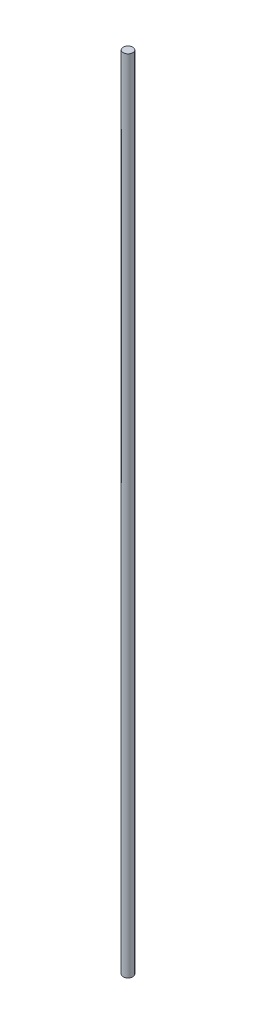
ISO-10303-21;
HEADER;
FILE_DESCRIPTION(('STEP AP214'),'2;1');
FILE_NAME('part.step','',(''),(''),'','','');
FILE_SCHEMA(('AUTOMOTIVE_DESIGN { 1 0 10303 214 1 1 1 1 }'));
ENDSEC;
DATA;
#1=APPLICATION_CONTEXT('core data for automotive mechanical design processes');
#2=APPLICATION_PROTOCOL_DEFINITION('international standard','automotive_design',2000,#1);
#3=PRODUCT_CONTEXT('',#1,'mechanical');
#4=PRODUCT('Part','Part','',(#3));
#5=PRODUCT_RELATED_PRODUCT_CATEGORY('part','',(#4));
#6=PRODUCT_DEFINITION_FORMATION('','',#4);
#7=PRODUCT_DEFINITION_CONTEXT('part definition',#1,'design');
#8=PRODUCT_DEFINITION('design','',#6,#7);
#9=PRODUCT_DEFINITION_SHAPE('','',#8);
#10=(LENGTH_UNIT() NAMED_UNIT(*) SI_UNIT(.MILLI.,.METRE.));
#11=(NAMED_UNIT(*) PLANE_ANGLE_UNIT() SI_UNIT($,.RADIAN.));
#12=(NAMED_UNIT(*) SI_UNIT($,.STERADIAN.) SOLID_ANGLE_UNIT());
#13=UNCERTAINTY_MEASURE_WITH_UNIT(LENGTH_MEASURE(1.E-05),#10,'distance_accuracy_value','');
#14=(GEOMETRIC_REPRESENTATION_CONTEXT(3) GLOBAL_UNCERTAINTY_ASSIGNED_CONTEXT((#13)) GLOBAL_UNIT_ASSIGNED_CONTEXT((#10,
#11,#12)) REPRESENTATION_CONTEXT('',''));
#15=CARTESIAN_POINT('',(0.,0.,0.));
#16=DIRECTION('',(0.,0.,1.));
#17=DIRECTION('',(1.,0.,0.));
#18=AXIS2_PLACEMENT_3D('',#15,#16,#17);
#19=CARTESIAN_POINT('',(0.,2080.,-2.9868094022561));
#20=DIRECTION('',(0.,-1.,0.));
#21=DIRECTION('',(0.,0.,-1.));
#22=AXIS2_PLACEMENT_3D('',#19,#20,#21);
#23=CYLINDRICAL_SURFACE('',#22,12.5);
#24=CARTESIAN_POINT('',(0.,2080.,-2.9868094022561));
#25=DIRECTION('',(0.,1.,0.));
#26=DIRECTION('',(0.,0.,1.));
#27=AXIS2_PLACEMENT_3D('',#24,#25,#26);
#28=CIRCLE('',#27,12.5);
#29=CARTESIAN_POINT('',(0.,2080.,9.51319059774391));
#30=VERTEX_POINT('',#29);
#31=EDGE_CURVE('E10',#30,#30,#28,.T.);
#32=ORIENTED_EDGE('',*,*,#31,.F.);
#33=EDGE_LOOP('',(#32));
#34=FACE_BOUND('',#33,.T.);
#35=CARTESIAN_POINT('',(0.,0.,-2.9868094022561));
#36=DIRECTION('',(0.,1.,0.));
#37=DIRECTION('',(0.,0.,1.));
#38=AXIS2_PLACEMENT_3D('',#35,#36,#37);
#39=CIRCLE('',#38,12.5);
#40=CARTESIAN_POINT('',(0.,0.,9.51319059774391));
#41=VERTEX_POINT('',#40);
#42=EDGE_CURVE('E40',#41,#41,#39,.T.);
#43=ORIENTED_EDGE('',*,*,#42,.T.);
#44=EDGE_LOOP('',(#43));
#45=FACE_BOUND('',#44,.T.);
#46=ADVANCED_FACE('F37',(#34,#45),#23,.T.);
#47=CARTESIAN_POINT('',(0.,2080.,-2.9868094022561));
#48=DIRECTION('',(0.,1.,0.));
#49=DIRECTION('',(0.,0.,1.));
#50=AXIS2_PLACEMENT_3D('',#47,#48,#49);
#51=PLANE('',#50);
#52=ORIENTED_EDGE('',*,*,#31,.T.);
#53=EDGE_LOOP('',(#52));
#54=FACE_BOUND('',#53,.T.);
#55=ADVANCED_FACE('F52',(#54),#51,.T.);
#56=CARTESIAN_POINT('',(0.,0.,-2.9868094022561));
#57=DIRECTION('',(0.,1.,0.));
#58=DIRECTION('',(0.,0.,1.));
#59=AXIS2_PLACEMENT_3D('',#56,#57,#58);
#60=PLANE('',#59);
#61=ORIENTED_EDGE('',*,*,#42,.F.);
#62=EDGE_LOOP('',(#61));
#63=FACE_BOUND('',#62,.T.);
#64=ADVANCED_FACE('F50',(#63),#60,.F.);
#65=CLOSED_SHELL('',(#46,#55,#64));
#66=MANIFOLD_SOLID_BREP('B2',#65);
#67=ADVANCED_BREP_SHAPE_REPRESENTATION('',(#18,#66),#14);
#68=SHAPE_DEFINITION_REPRESENTATION(#9,#67);
ENDSEC;
END-ISO-10303-21;
